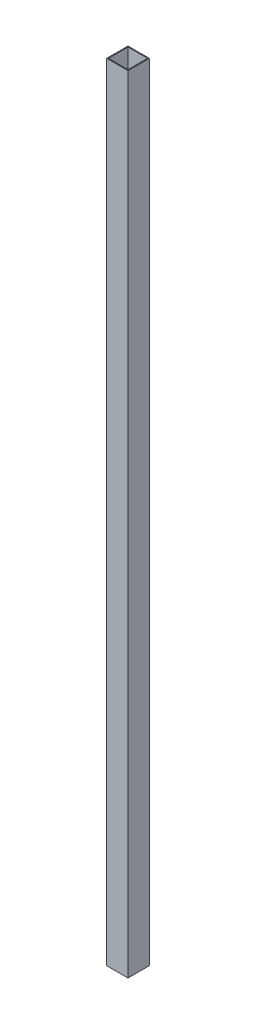
ISO-10303-21;
HEADER;
FILE_DESCRIPTION(('STEP AP214'),'2;1');
FILE_NAME('part.step','',(''),(''),'','','');
FILE_SCHEMA(('AUTOMOTIVE_DESIGN { 1 0 10303 214 1 1 1 1 }'));
ENDSEC;
DATA;
#1=APPLICATION_CONTEXT('core data for automotive mechanical design processes');
#2=APPLICATION_PROTOCOL_DEFINITION('international standard','automotive_design',2000,#1);
#3=PRODUCT_CONTEXT('',#1,'mechanical');
#4=PRODUCT('Part','Part','',(#3));
#5=PRODUCT_RELATED_PRODUCT_CATEGORY('part','',(#4));
#6=PRODUCT_DEFINITION_FORMATION('','',#4);
#7=PRODUCT_DEFINITION_CONTEXT('part definition',#1,'design');
#8=PRODUCT_DEFINITION('design','',#6,#7);
#9=PRODUCT_DEFINITION_SHAPE('','',#8);
#10=(LENGTH_UNIT() NAMED_UNIT(*) SI_UNIT(.MILLI.,.METRE.));
#11=(NAMED_UNIT(*) PLANE_ANGLE_UNIT() SI_UNIT($,.RADIAN.));
#12=(NAMED_UNIT(*) SI_UNIT($,.STERADIAN.) SOLID_ANGLE_UNIT());
#13=UNCERTAINTY_MEASURE_WITH_UNIT(LENGTH_MEASURE(1.E-05),#10,'distance_accuracy_value','');
#14=(GEOMETRIC_REPRESENTATION_CONTEXT(3) GLOBAL_UNCERTAINTY_ASSIGNED_CONTEXT((#13)) GLOBAL_UNIT_ASSIGNED_CONTEXT((#10,
#11,#12)) REPRESENTATION_CONTEXT('',''));
#15=CARTESIAN_POINT('',(0.,0.,0.));
#16=DIRECTION('',(0.,0.,1.));
#17=DIRECTION('',(1.,0.,0.));
#18=AXIS2_PLACEMENT_3D('',#15,#16,#17);
#19=CARTESIAN_POINT('',(0.,922.5,0.));
#20=DIRECTION('',(0.,-1.,0.));
#21=DIRECTION('',(0.,0.,-1.));
#22=AXIS2_PLACEMENT_3D('',#19,#20,#21);
#23=PLANE('',#22);
#24=DIRECTION('',(0.,0.,-1.));
#25=VECTOR('',#24,1.);
#26=CARTESIAN_POINT('',(12.5,922.5,12.5));
#27=LINE('',#26,#25);
#28=CARTESIAN_POINT('',(12.5,922.5,12.5));
#29=VERTEX_POINT('',#28);
#30=CARTESIAN_POINT('',(12.5,922.5,-12.5));
#31=VERTEX_POINT('',#30);
#32=EDGE_CURVE('E138',#29,#31,#27,.T.);
#33=ORIENTED_EDGE('',*,*,#32,.T.);
#34=DIRECTION('',(-1.,0.,0.));
#35=VECTOR('',#34,1.);
#36=CARTESIAN_POINT('',(-12.5,922.5,-12.5));
#37=LINE('',#36,#35);
#38=CARTESIAN_POINT('',(-12.5,922.5,-12.5));
#39=VERTEX_POINT('',#38);
#40=EDGE_CURVE('E141',#31,#39,#37,.T.);
#41=ORIENTED_EDGE('',*,*,#40,.T.);
#42=DIRECTION('',(0.,0.,1.));
#43=VECTOR('',#42,1.);
#44=CARTESIAN_POINT('',(-12.5,922.5,12.5));
#45=LINE('',#44,#43);
#46=CARTESIAN_POINT('',(-12.5,922.5,12.5));
#47=VERTEX_POINT('',#46);
#48=EDGE_CURVE('E144',#39,#47,#45,.T.);
#49=ORIENTED_EDGE('',*,*,#48,.T.);
#50=DIRECTION('',(1.,0.,0.));
#51=VECTOR('',#50,1.);
#52=CARTESIAN_POINT('',(-12.5,922.5,12.5));
#53=LINE('',#52,#51);
#54=EDGE_CURVE('E146',#47,#29,#53,.T.);
#55=ORIENTED_EDGE('',*,*,#54,.T.);
#56=EDGE_LOOP('',(#33,#41,#49,#55));
#57=FACE_BOUND('',#56,.T.);
#58=DIRECTION('',(0.,0.,1.));
#59=VECTOR('',#58,1.);
#60=CARTESIAN_POINT('',(-11.5,922.5,11.5));
#61=LINE('',#60,#59);
#62=CARTESIAN_POINT('',(-11.5,922.5,-11.5));
#63=VERTEX_POINT('',#62);
#64=CARTESIAN_POINT('',(-11.5,922.5,11.5));
#65=VERTEX_POINT('',#64);
#66=EDGE_CURVE('E102',#63,#65,#61,.T.);
#67=ORIENTED_EDGE('',*,*,#66,.F.);
#68=DIRECTION('',(-1.,0.,0.));
#69=VECTOR('',#68,1.);
#70=CARTESIAN_POINT('',(-11.5,922.5,-11.5));
#71=LINE('',#70,#69);
#72=CARTESIAN_POINT('',(11.5,922.5,-11.5));
#73=VERTEX_POINT('',#72);
#74=EDGE_CURVE('E124',#73,#63,#71,.T.);
#75=ORIENTED_EDGE('',*,*,#74,.F.);
#76=DIRECTION('',(0.,0.,-1.));
#77=VECTOR('',#76,1.);
#78=CARTESIAN_POINT('',(11.5,922.5,11.5));
#79=LINE('',#78,#77);
#80=CARTESIAN_POINT('',(11.5,922.5,11.5));
#81=VERTEX_POINT('',#80);
#82=EDGE_CURVE('E122',#81,#73,#79,.T.);
#83=ORIENTED_EDGE('',*,*,#82,.F.);
#84=DIRECTION('',(1.,0.,0.));
#85=VECTOR('',#84,1.);
#86=CARTESIAN_POINT('',(-11.5,922.5,11.5));
#87=LINE('',#86,#85);
#88=EDGE_CURVE('E110',#65,#81,#87,.T.);
#89=ORIENTED_EDGE('',*,*,#88,.F.);
#90=EDGE_LOOP('',(#67,#75,#83,#89));
#91=FACE_BOUND('',#90,.T.);
#92=ADVANCED_FACE('F37',(#57,#91),#23,.F.);
#93=CARTESIAN_POINT('',(0.,0.,0.));
#94=DIRECTION('',(0.,-1.,0.));
#95=DIRECTION('',(0.,0.,-1.));
#96=AXIS2_PLACEMENT_3D('',#93,#94,#95);
#97=PLANE('',#96);
#98=DIRECTION('',(0.,0.,-1.));
#99=VECTOR('',#98,1.);
#100=CARTESIAN_POINT('',(12.5,0.,12.5));
#101=LINE('',#100,#99);
#102=CARTESIAN_POINT('',(12.5,0.,12.5));
#103=VERTEX_POINT('',#102);
#104=CARTESIAN_POINT('',(12.5,0.,-12.5));
#105=VERTEX_POINT('',#104);
#106=EDGE_CURVE('E118',#103,#105,#101,.T.);
#107=ORIENTED_EDGE('',*,*,#106,.F.);
#108=DIRECTION('',(1.,0.,0.));
#109=VECTOR('',#108,1.);
#110=CARTESIAN_POINT('',(-12.5,0.,12.5));
#111=LINE('',#110,#109);
#112=CARTESIAN_POINT('',(-12.5,0.,12.5));
#113=VERTEX_POINT('',#112);
#114=EDGE_CURVE('E142',#113,#103,#111,.T.);
#115=ORIENTED_EDGE('',*,*,#114,.F.);
#116=DIRECTION('',(0.,0.,1.));
#117=VECTOR('',#116,1.);
#118=CARTESIAN_POINT('',(-12.5,0.,12.5));
#119=LINE('',#118,#117);
#120=CARTESIAN_POINT('',(-12.5,0.,-12.5));
#121=VERTEX_POINT('',#120);
#122=EDGE_CURVE('E153',#121,#113,#119,.T.);
#123=ORIENTED_EDGE('',*,*,#122,.F.);
#124=DIRECTION('',(-1.,0.,0.));
#125=VECTOR('',#124,1.);
#126=CARTESIAN_POINT('',(-12.5,0.,-12.5));
#127=LINE('',#126,#125);
#128=EDGE_CURVE('E151',#105,#121,#127,.T.);
#129=ORIENTED_EDGE('',*,*,#128,.F.);
#130=EDGE_LOOP('',(#107,#115,#123,#129));
#131=FACE_BOUND('',#130,.T.);
#132=DIRECTION('',(-1.,0.,0.));
#133=VECTOR('',#132,1.);
#134=CARTESIAN_POINT('',(-11.5,0.,-11.5));
#135=LINE('',#134,#133);
#136=CARTESIAN_POINT('',(11.5,0.,-11.5));
#137=VERTEX_POINT('',#136);
#138=CARTESIAN_POINT('',(-11.5,0.,-11.5));
#139=VERTEX_POINT('',#138);
#140=EDGE_CURVE('E111',#137,#139,#135,.T.);
#141=ORIENTED_EDGE('',*,*,#140,.T.);
#142=DIRECTION('',(0.,0.,1.));
#143=VECTOR('',#142,1.);
#144=CARTESIAN_POINT('',(-11.5,0.,11.5));
#145=LINE('',#144,#143);
#146=CARTESIAN_POINT('',(-11.5,0.,11.5));
#147=VERTEX_POINT('',#146);
#148=EDGE_CURVE('E60',#139,#147,#145,.T.);
#149=ORIENTED_EDGE('',*,*,#148,.T.);
#150=DIRECTION('',(1.,0.,0.));
#151=VECTOR('',#150,1.);
#152=CARTESIAN_POINT('',(-11.5,0.,11.5));
#153=LINE('',#152,#151);
#154=CARTESIAN_POINT('',(11.5,0.,11.5));
#155=VERTEX_POINT('',#154);
#156=EDGE_CURVE('E117',#147,#155,#153,.T.);
#157=ORIENTED_EDGE('',*,*,#156,.T.);
#158=DIRECTION('',(0.,0.,-1.));
#159=VECTOR('',#158,1.);
#160=CARTESIAN_POINT('',(11.5,0.,11.5));
#161=LINE('',#160,#159);
#162=EDGE_CURVE('E130',#155,#137,#161,.T.);
#163=ORIENTED_EDGE('',*,*,#162,.T.);
#164=EDGE_LOOP('',(#141,#149,#157,#163));
#165=FACE_BOUND('',#164,.T.);
#166=ADVANCED_FACE('F171',(#131,#165),#97,.T.);
#167=CARTESIAN_POINT('',(12.5,922.5,12.5));
#168=DIRECTION('',(-1.,0.,0.));
#169=DIRECTION('',(0.,0.,1.));
#170=AXIS2_PLACEMENT_3D('',#167,#168,#169);
#171=PLANE('',#170);
#172=ORIENTED_EDGE('',*,*,#106,.T.);
#173=DIRECTION('',(0.,-1.,0.));
#174=VECTOR('',#173,1.);
#175=CARTESIAN_POINT('',(12.5,922.5,-12.5));
#176=LINE('',#175,#174);
#177=EDGE_CURVE('E11',#31,#105,#176,.T.);
#178=ORIENTED_EDGE('',*,*,#177,.F.);
#179=ORIENTED_EDGE('',*,*,#32,.F.);
#180=DIRECTION('',(0.,-1.,0.));
#181=VECTOR('',#180,1.);
#182=CARTESIAN_POINT('',(12.5,922.5,12.5));
#183=LINE('',#182,#181);
#184=EDGE_CURVE('E148',#29,#103,#183,.T.);
#185=ORIENTED_EDGE('',*,*,#184,.T.);
#186=EDGE_LOOP('',(#172,#178,#179,#185));
#187=FACE_BOUND('',#186,.T.);
#188=ADVANCED_FACE('F39',(#187),#171,.F.);
#189=CARTESIAN_POINT('',(-12.5,922.5,-12.5));
#190=DIRECTION('',(0.,0.,1.));
#191=DIRECTION('',(1.,0.,0.));
#192=AXIS2_PLACEMENT_3D('',#189,#190,#191);
#193=PLANE('',#192);
#194=ORIENTED_EDGE('',*,*,#128,.T.);
#195=DIRECTION('',(0.,-1.,0.));
#196=VECTOR('',#195,1.);
#197=CARTESIAN_POINT('',(-12.5,922.5,-12.5));
#198=LINE('',#197,#196);
#199=EDGE_CURVE('E45',#39,#121,#198,.T.);
#200=ORIENTED_EDGE('',*,*,#199,.F.);
#201=ORIENTED_EDGE('',*,*,#40,.F.);
#202=ORIENTED_EDGE('',*,*,#177,.T.);
#203=EDGE_LOOP('',(#194,#200,#201,#202));
#204=FACE_BOUND('',#203,.T.);
#205=ADVANCED_FACE('F181',(#204),#193,.F.);
#206=CARTESIAN_POINT('',(-12.5,922.5,12.5));
#207=DIRECTION('',(1.,0.,0.));
#208=DIRECTION('',(0.,0.,-1.));
#209=AXIS2_PLACEMENT_3D('',#206,#207,#208);
#210=PLANE('',#209);
#211=ORIENTED_EDGE('',*,*,#122,.T.);
#212=DIRECTION('',(0.,-1.,0.));
#213=VECTOR('',#212,1.);
#214=CARTESIAN_POINT('',(-12.5,922.5,12.5));
#215=LINE('',#214,#213);
#216=EDGE_CURVE('E158',#47,#113,#215,.T.);
#217=ORIENTED_EDGE('',*,*,#216,.F.);
#218=ORIENTED_EDGE('',*,*,#48,.F.);
#219=ORIENTED_EDGE('',*,*,#199,.T.);
#220=EDGE_LOOP('',(#211,#217,#218,#219));
#221=FACE_BOUND('',#220,.T.);
#222=ADVANCED_FACE('F165',(#221),#210,.F.);
#223=CARTESIAN_POINT('',(-12.5,922.5,12.5));
#224=DIRECTION('',(0.,0.,-1.));
#225=DIRECTION('',(-1.,0.,0.));
#226=AXIS2_PLACEMENT_3D('',#223,#224,#225);
#227=PLANE('',#226);
#228=ORIENTED_EDGE('',*,*,#114,.T.);
#229=ORIENTED_EDGE('',*,*,#184,.F.);
#230=ORIENTED_EDGE('',*,*,#54,.F.);
#231=ORIENTED_EDGE('',*,*,#216,.T.);
#232=EDGE_LOOP('',(#228,#229,#230,#231));
#233=FACE_BOUND('',#232,.T.);
#234=ADVANCED_FACE('F175',(#233),#227,.F.);
#235=CARTESIAN_POINT('',(-11.5,922.5,11.5));
#236=DIRECTION('',(1.,0.,0.));
#237=DIRECTION('',(0.,0.,-1.));
#238=AXIS2_PLACEMENT_3D('',#235,#236,#237);
#239=PLANE('',#238);
#240=ORIENTED_EDGE('',*,*,#148,.F.);
#241=DIRECTION('',(0.,-1.,0.));
#242=VECTOR('',#241,1.);
#243=CARTESIAN_POINT('',(-11.5,922.5,-11.5));
#244=LINE('',#243,#242);
#245=EDGE_CURVE('E106',#63,#139,#244,.T.);
#246=ORIENTED_EDGE('',*,*,#245,.F.);
#247=ORIENTED_EDGE('',*,*,#66,.T.);
#248=DIRECTION('',(0.,-1.,0.));
#249=VECTOR('',#248,1.);
#250=CARTESIAN_POINT('',(-11.5,922.5,11.5));
#251=LINE('',#250,#249);
#252=EDGE_CURVE('E105',#65,#147,#251,.T.);
#253=ORIENTED_EDGE('',*,*,#252,.T.);
#254=EDGE_LOOP('',(#240,#246,#247,#253));
#255=FACE_BOUND('',#254,.T.);
#256=ADVANCED_FACE('F104',(#255),#239,.T.);
#257=CARTESIAN_POINT('',(-11.5,922.5,11.5));
#258=DIRECTION('',(0.,0.,-1.));
#259=DIRECTION('',(-1.,0.,0.));
#260=AXIS2_PLACEMENT_3D('',#257,#258,#259);
#261=PLANE('',#260);
#262=ORIENTED_EDGE('',*,*,#156,.F.);
#263=ORIENTED_EDGE('',*,*,#252,.F.);
#264=ORIENTED_EDGE('',*,*,#88,.T.);
#265=DIRECTION('',(0.,-1.,0.));
#266=VECTOR('',#265,1.);
#267=CARTESIAN_POINT('',(11.5,922.5,11.5));
#268=LINE('',#267,#266);
#269=EDGE_CURVE('E119',#81,#155,#268,.T.);
#270=ORIENTED_EDGE('',*,*,#269,.T.);
#271=EDGE_LOOP('',(#262,#263,#264,#270));
#272=FACE_BOUND('',#271,.T.);
#273=ADVANCED_FACE('F114',(#272),#261,.T.);
#274=CARTESIAN_POINT('',(11.5,922.5,11.5));
#275=DIRECTION('',(-1.,0.,0.));
#276=DIRECTION('',(0.,0.,1.));
#277=AXIS2_PLACEMENT_3D('',#274,#275,#276);
#278=PLANE('',#277);
#279=ORIENTED_EDGE('',*,*,#162,.F.);
#280=ORIENTED_EDGE('',*,*,#269,.F.);
#281=ORIENTED_EDGE('',*,*,#82,.T.);
#282=DIRECTION('',(0.,-1.,0.));
#283=VECTOR('',#282,1.);
#284=CARTESIAN_POINT('',(11.5,922.5,-11.5));
#285=LINE('',#284,#283);
#286=EDGE_CURVE('E52',#73,#137,#285,.T.);
#287=ORIENTED_EDGE('',*,*,#286,.T.);
#288=EDGE_LOOP('',(#279,#280,#281,#287));
#289=FACE_BOUND('',#288,.T.);
#290=ADVANCED_FACE('F204',(#289),#278,.T.);
#291=CARTESIAN_POINT('',(-11.5,922.5,-11.5));
#292=DIRECTION('',(0.,0.,1.));
#293=DIRECTION('',(1.,0.,0.));
#294=AXIS2_PLACEMENT_3D('',#291,#292,#293);
#295=PLANE('',#294);
#296=ORIENTED_EDGE('',*,*,#140,.F.);
#297=ORIENTED_EDGE('',*,*,#286,.F.);
#298=ORIENTED_EDGE('',*,*,#74,.T.);
#299=ORIENTED_EDGE('',*,*,#245,.T.);
#300=EDGE_LOOP('',(#296,#297,#298,#299));
#301=FACE_BOUND('',#300,.T.);
#302=ADVANCED_FACE('F208',(#301),#295,.T.);
#303=CLOSED_SHELL('',(#92,#166,#188,#205,#222,#234,#256,#273,#290,#302));
#304=MANIFOLD_SOLID_BREP('B2',#303);
#305=ADVANCED_BREP_SHAPE_REPRESENTATION('',(#18,#304),#14);
#306=SHAPE_DEFINITION_REPRESENTATION(#9,#305);
ENDSEC;
END-ISO-10303-21;
